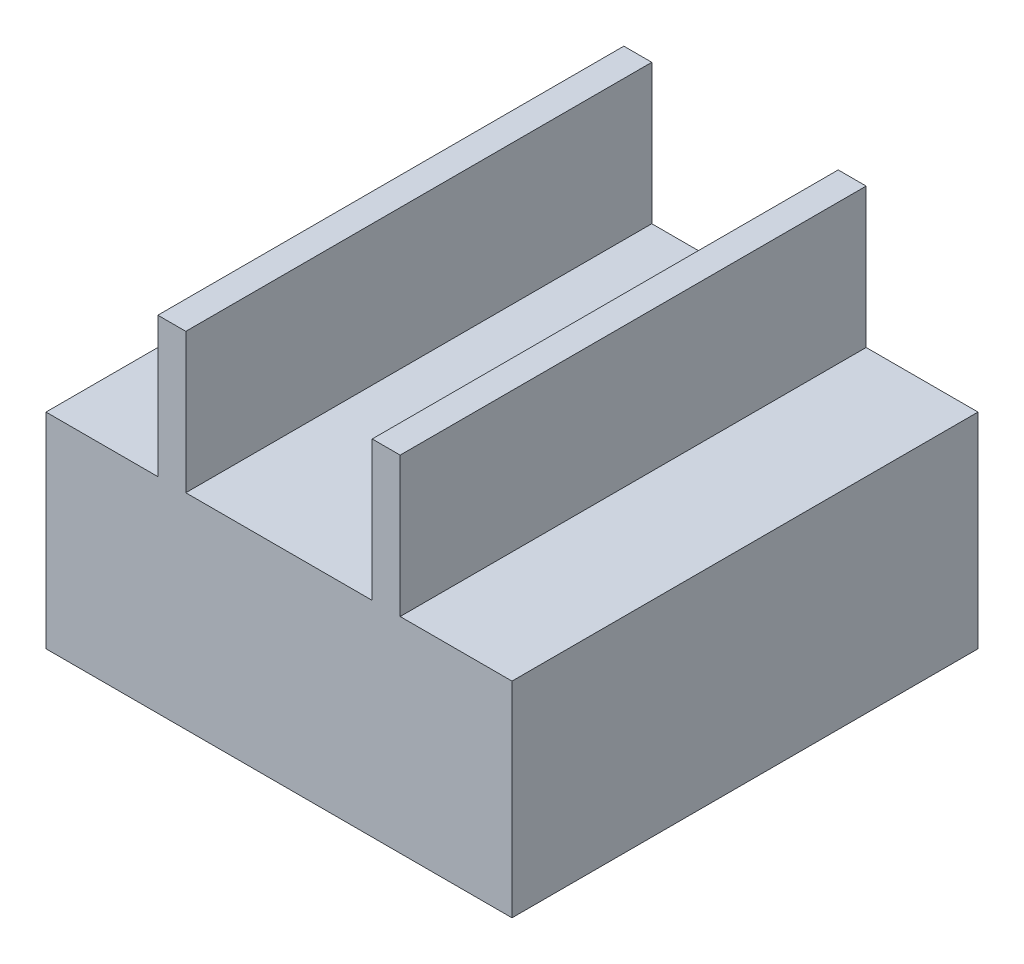
ISO-10303-21;
HEADER;
FILE_DESCRIPTION(('STEP AP214'),'2;1');
FILE_NAME('part.step','',(''),(''),'','','');
FILE_SCHEMA(('AUTOMOTIVE_DESIGN { 1 0 10303 214 1 1 1 1 }'));
ENDSEC;
DATA;
#1=APPLICATION_CONTEXT('core data for automotive mechanical design processes');
#2=APPLICATION_PROTOCOL_DEFINITION('international standard','automotive_design',2000,#1);
#3=PRODUCT_CONTEXT('',#1,'mechanical');
#4=PRODUCT('Part','Part','',(#3));
#5=PRODUCT_RELATED_PRODUCT_CATEGORY('part','',(#4));
#6=PRODUCT_DEFINITION_FORMATION('','',#4);
#7=PRODUCT_DEFINITION_CONTEXT('part definition',#1,'design');
#8=PRODUCT_DEFINITION('design','',#6,#7);
#9=PRODUCT_DEFINITION_SHAPE('','',#8);
#10=(LENGTH_UNIT() NAMED_UNIT(*) SI_UNIT(.MILLI.,.METRE.));
#11=(NAMED_UNIT(*) PLANE_ANGLE_UNIT() SI_UNIT($,.RADIAN.));
#12=(NAMED_UNIT(*) SI_UNIT($,.STERADIAN.) SOLID_ANGLE_UNIT());
#13=UNCERTAINTY_MEASURE_WITH_UNIT(LENGTH_MEASURE(1.E-05),#10,'distance_accuracy_value','');
#14=(GEOMETRIC_REPRESENTATION_CONTEXT(3) GLOBAL_UNCERTAINTY_ASSIGNED_CONTEXT((#13)) GLOBAL_UNIT_ASSIGNED_CONTEXT((#10,
#11,#12)) REPRESENTATION_CONTEXT('',''));
#15=CARTESIAN_POINT('',(0.,0.,0.));
#16=DIRECTION('',(0.,0.,1.));
#17=DIRECTION('',(1.,0.,0.));
#18=AXIS2_PLACEMENT_3D('',#15,#16,#17);
#19=CARTESIAN_POINT('',(-25.,2.,-25.));
#20=DIRECTION('',(1.,0.,0.));
#21=DIRECTION('',(0.,0.,-1.));
#22=AXIS2_PLACEMENT_3D('',#19,#20,#21);
#23=PLANE('',#22);
#24=DIRECTION('',(0.,-1.,0.));
#25=VECTOR('',#24,1.);
#26=CARTESIAN_POINT('',(-25.,2.,-25.));
#27=LINE('',#26,#25);
#28=CARTESIAN_POINT('',(-25.,2.,-25.));
#29=VERTEX_POINT('',#28);
#30=CARTESIAN_POINT('',(-25.,-20.,-25.));
#31=VERTEX_POINT('',#30);
#32=EDGE_CURVE('E280',#29,#31,#27,.T.);
#33=ORIENTED_EDGE('',*,*,#32,.T.);
#34=DIRECTION('',(0.,0.,-1.));
#35=VECTOR('',#34,1.);
#36=CARTESIAN_POINT('',(-25.,-20.,0.));
#37=LINE('',#36,#35);
#38=CARTESIAN_POINT('',(-25.,-20.,25.));
#39=VERTEX_POINT('',#38);
#40=EDGE_CURVE('E208',#39,#31,#37,.T.);
#41=ORIENTED_EDGE('',*,*,#40,.F.);
#42=DIRECTION('',(0.,-1.,0.));
#43=VECTOR('',#42,1.);
#44=CARTESIAN_POINT('',(-25.,2.,25.));
#45=LINE('',#44,#43);
#46=CARTESIAN_POINT('',(-25.,2.,25.));
#47=VERTEX_POINT('',#46);
#48=EDGE_CURVE('E287',#47,#39,#45,.T.);
#49=ORIENTED_EDGE('',*,*,#48,.F.);
#50=DIRECTION('',(0.,0.,1.));
#51=VECTOR('',#50,1.);
#52=CARTESIAN_POINT('',(-25.,2.,-25.));
#53=LINE('',#52,#51);
#54=EDGE_CURVE('E268',#29,#47,#53,.T.);
#55=ORIENTED_EDGE('',*,*,#54,.F.);
#56=EDGE_LOOP('',(#33,#41,#49,#55));
#57=FACE_BOUND('',#56,.T.);
#58=ADVANCED_FACE('F48',(#57),#23,.F.);
#59=CARTESIAN_POINT('',(0.,2.,0.));
#60=DIRECTION('',(0.,-1.,0.));
#61=DIRECTION('',(0.,0.,-1.));
#62=AXIS2_PLACEMENT_3D('',#59,#60,#61);
#63=PLANE('',#62);
#64=DIRECTION('',(0.,0.,1.));
#65=VECTOR('',#64,1.);
#66=CARTESIAN_POINT('',(10.,2.,0.));
#67=LINE('',#66,#65);
#68=CARTESIAN_POINT('',(10.,2.,-25.));
#69=VERTEX_POINT('',#68);
#70=CARTESIAN_POINT('',(10.,2.,25.));
#71=VERTEX_POINT('',#70);
#72=EDGE_CURVE('E219',#69,#71,#67,.T.);
#73=ORIENTED_EDGE('',*,*,#72,.F.);
#74=DIRECTION('',(-1.,0.,0.));
#75=VECTOR('',#74,1.);
#76=CARTESIAN_POINT('',(25.,2.,-25.));
#77=LINE('',#76,#75);
#78=CARTESIAN_POINT('',(-10.,2.,-25.));
#79=VERTEX_POINT('',#78);
#80=EDGE_CURVE('E281',#69,#79,#77,.T.);
#81=ORIENTED_EDGE('',*,*,#80,.T.);
#82=DIRECTION('',(0.,0.,1.));
#83=VECTOR('',#82,1.);
#84=CARTESIAN_POINT('',(-10.,2.,0.));
#85=LINE('',#84,#83);
#86=CARTESIAN_POINT('',(-10.,2.,25.));
#87=VERTEX_POINT('',#86);
#88=EDGE_CURVE('E246',#79,#87,#85,.T.);
#89=ORIENTED_EDGE('',*,*,#88,.T.);
#90=DIRECTION('',(1.,0.,0.));
#91=VECTOR('',#90,1.);
#92=CARTESIAN_POINT('',(25.,2.,25.));
#93=LINE('',#92,#91);
#94=EDGE_CURVE('E275',#87,#71,#93,.T.);
#95=ORIENTED_EDGE('',*,*,#94,.T.);
#96=EDGE_LOOP('',(#73,#81,#89,#95));
#97=FACE_BOUND('',#96,.T.);
#98=ADVANCED_FACE('F338',(#97),#63,.F.);
#99=DIRECTION('',(0.,0.,1.));
#100=VECTOR('',#99,1.);
#101=CARTESIAN_POINT('',(-13.,2.,0.));
#102=LINE('',#101,#100);
#103=CARTESIAN_POINT('',(-13.,2.,-25.));
#104=VERTEX_POINT('',#103);
#105=CARTESIAN_POINT('',(-13.,2.,25.));
#106=VERTEX_POINT('',#105);
#107=EDGE_CURVE('E241',#104,#106,#102,.T.);
#108=ORIENTED_EDGE('',*,*,#107,.F.);
#109=EDGE_CURVE('E277',#104,#29,#77,.T.);
#110=ORIENTED_EDGE('',*,*,#109,.T.);
#111=ORIENTED_EDGE('',*,*,#54,.T.);
#112=EDGE_CURVE('E272',#47,#106,#93,.T.);
#113=ORIENTED_EDGE('',*,*,#112,.T.);
#114=EDGE_LOOP('',(#108,#110,#111,#113));
#115=FACE_BOUND('',#114,.T.);
#116=ADVANCED_FACE('F344',(#115),#63,.F.);
#117=CARTESIAN_POINT('',(25.,2.,25.));
#118=DIRECTION('',(0.,0.,-1.));
#119=DIRECTION('',(-1.,0.,0.));
#120=AXIS2_PLACEMENT_3D('',#117,#118,#119);
#121=PLANE('',#120);
#122=DIRECTION('',(0.,-1.,0.));
#123=VECTOR('',#122,1.);
#124=CARTESIAN_POINT('',(10.,17.,25.));
#125=LINE('',#124,#123);
#126=CARTESIAN_POINT('',(10.,17.,25.));
#127=VERTEX_POINT('',#126);
#128=EDGE_CURVE('E232',#127,#71,#125,.T.);
#129=ORIENTED_EDGE('',*,*,#128,.T.);
#130=ORIENTED_EDGE('',*,*,#94,.F.);
#131=DIRECTION('',(0.,-1.,0.));
#132=VECTOR('',#131,1.);
#133=CARTESIAN_POINT('',(-10.,17.,25.));
#134=LINE('',#133,#132);
#135=CARTESIAN_POINT('',(-10.,17.,25.));
#136=VERTEX_POINT('',#135);
#137=EDGE_CURVE('E259',#136,#87,#134,.T.);
#138=ORIENTED_EDGE('',*,*,#137,.F.);
#139=DIRECTION('',(1.,0.,0.));
#140=VECTOR('',#139,1.);
#141=CARTESIAN_POINT('',(0.,17.,25.));
#142=LINE('',#141,#140);
#143=CARTESIAN_POINT('',(-13.,17.,25.));
#144=VERTEX_POINT('',#143);
#145=EDGE_CURVE('E248',#144,#136,#142,.T.);
#146=ORIENTED_EDGE('',*,*,#145,.F.);
#147=DIRECTION('',(0.,-1.,0.));
#148=VECTOR('',#147,1.);
#149=CARTESIAN_POINT('',(-13.,17.,25.));
#150=LINE('',#149,#148);
#151=EDGE_CURVE('E262',#144,#106,#150,.T.);
#152=ORIENTED_EDGE('',*,*,#151,.T.);
#153=ORIENTED_EDGE('',*,*,#112,.F.);
#154=ORIENTED_EDGE('',*,*,#48,.T.);
#155=DIRECTION('',(-1.,0.,0.));
#156=VECTOR('',#155,1.);
#157=CARTESIAN_POINT('',(-25.,-20.,25.));
#158=LINE('',#157,#156);
#159=CARTESIAN_POINT('',(25.,-20.,25.));
#160=VERTEX_POINT('',#159);
#161=EDGE_CURVE('E211',#160,#39,#158,.T.);
#162=ORIENTED_EDGE('',*,*,#161,.F.);
#163=DIRECTION('',(0.,-1.,0.));
#164=VECTOR('',#163,1.);
#165=CARTESIAN_POINT('',(25.,2.,25.));
#166=LINE('',#165,#164);
#167=CARTESIAN_POINT('',(25.,2.,25.));
#168=VERTEX_POINT('',#167);
#169=EDGE_CURVE('E285',#168,#160,#166,.T.);
#170=ORIENTED_EDGE('',*,*,#169,.F.);
#171=CARTESIAN_POINT('',(13.,2.,25.));
#172=VERTEX_POINT('',#171);
#173=EDGE_CURVE('E271',#172,#168,#93,.T.);
#174=ORIENTED_EDGE('',*,*,#173,.F.);
#175=DIRECTION('',(0.,-1.,0.));
#176=VECTOR('',#175,1.);
#177=CARTESIAN_POINT('',(13.,17.,25.));
#178=LINE('',#177,#176);
#179=CARTESIAN_POINT('',(13.,17.,25.));
#180=VERTEX_POINT('',#179);
#181=EDGE_CURVE('E225',#180,#172,#178,.T.);
#182=ORIENTED_EDGE('',*,*,#181,.F.);
#183=DIRECTION('',(1.,0.,0.));
#184=VECTOR('',#183,1.);
#185=CARTESIAN_POINT('',(0.,17.,25.));
#186=LINE('',#185,#184);
#187=EDGE_CURVE('E223',#127,#180,#186,.T.);
#188=ORIENTED_EDGE('',*,*,#187,.F.);
#189=EDGE_LOOP('',(#129,#130,#138,#146,#152,#153,#154,#162,#170,#174,#182,#188));
#190=FACE_BOUND('',#189,.T.);
#191=ADVANCED_FACE('F350',(#190),#121,.F.);
#192=CARTESIAN_POINT('',(25.,2.,-25.));
#193=DIRECTION('',(-1.,0.,0.));
#194=DIRECTION('',(0.,0.,1.));
#195=AXIS2_PLACEMENT_3D('',#192,#193,#194);
#196=PLANE('',#195);
#197=ORIENTED_EDGE('',*,*,#169,.T.);
#198=DIRECTION('',(0.,0.,1.));
#199=VECTOR('',#198,1.);
#200=CARTESIAN_POINT('',(25.,-20.,0.));
#201=LINE('',#200,#199);
#202=CARTESIAN_POINT('',(25.,-20.,-25.));
#203=VERTEX_POINT('',#202);
#204=EDGE_CURVE('E202',#203,#160,#201,.T.);
#205=ORIENTED_EDGE('',*,*,#204,.F.);
#206=DIRECTION('',(0.,-1.,0.));
#207=VECTOR('',#206,1.);
#208=CARTESIAN_POINT('',(25.,2.,-25.));
#209=LINE('',#208,#207);
#210=CARTESIAN_POINT('',(25.,2.,-25.));
#211=VERTEX_POINT('',#210);
#212=EDGE_CURVE('E283',#211,#203,#209,.T.);
#213=ORIENTED_EDGE('',*,*,#212,.F.);
#214=DIRECTION('',(0.,0.,-1.));
#215=VECTOR('',#214,1.);
#216=CARTESIAN_POINT('',(25.,2.,-25.));
#217=LINE('',#216,#215);
#218=EDGE_CURVE('E274',#168,#211,#217,.T.);
#219=ORIENTED_EDGE('',*,*,#218,.F.);
#220=EDGE_LOOP('',(#197,#205,#213,#219));
#221=FACE_BOUND('',#220,.T.);
#222=ADVANCED_FACE('F411',(#221),#196,.F.);
#223=CARTESIAN_POINT('',(25.,2.,-25.));
#224=DIRECTION('',(0.,0.,1.));
#225=DIRECTION('',(1.,0.,0.));
#226=AXIS2_PLACEMENT_3D('',#223,#224,#225);
#227=PLANE('',#226);
#228=DIRECTION('',(0.,-1.,0.));
#229=VECTOR('',#228,1.);
#230=CARTESIAN_POINT('',(-10.,17.,-25.));
#231=LINE('',#230,#229);
#232=CARTESIAN_POINT('',(-10.,17.,-25.));
#233=VERTEX_POINT('',#232);
#234=EDGE_CURVE('E253',#233,#79,#231,.T.);
#235=ORIENTED_EDGE('',*,*,#234,.T.);
#236=ORIENTED_EDGE('',*,*,#80,.F.);
#237=DIRECTION('',(0.,-1.,0.));
#238=VECTOR('',#237,1.);
#239=CARTESIAN_POINT('',(10.,17.,-25.));
#240=LINE('',#239,#238);
#241=CARTESIAN_POINT('',(10.,17.,-25.));
#242=VERTEX_POINT('',#241);
#243=EDGE_CURVE('E235',#242,#69,#240,.T.);
#244=ORIENTED_EDGE('',*,*,#243,.F.);
#245=DIRECTION('',(-1.,0.,0.));
#246=VECTOR('',#245,1.);
#247=CARTESIAN_POINT('',(0.,17.,-25.));
#248=LINE('',#247,#246);
#249=CARTESIAN_POINT('',(13.,17.,-25.));
#250=VERTEX_POINT('',#249);
#251=EDGE_CURVE('E218',#250,#242,#248,.T.);
#252=ORIENTED_EDGE('',*,*,#251,.F.);
#253=DIRECTION('',(0.,-1.,0.));
#254=VECTOR('',#253,1.);
#255=CARTESIAN_POINT('',(13.,17.,-25.));
#256=LINE('',#255,#254);
#257=CARTESIAN_POINT('',(13.,2.,-25.));
#258=VERTEX_POINT('',#257);
#259=EDGE_CURVE('E238',#250,#258,#256,.T.);
#260=ORIENTED_EDGE('',*,*,#259,.T.);
#261=EDGE_CURVE('E278',#211,#258,#77,.T.);
#262=ORIENTED_EDGE('',*,*,#261,.F.);
#263=ORIENTED_EDGE('',*,*,#212,.T.);
#264=DIRECTION('',(1.,0.,0.));
#265=VECTOR('',#264,1.);
#266=CARTESIAN_POINT('',(-25.,-20.,-25.));
#267=LINE('',#266,#265);
#268=EDGE_CURVE('E289',#31,#203,#267,.T.);
#269=ORIENTED_EDGE('',*,*,#268,.F.);
#270=ORIENTED_EDGE('',*,*,#32,.F.);
#271=ORIENTED_EDGE('',*,*,#109,.F.);
#272=DIRECTION('',(0.,-1.,0.));
#273=VECTOR('',#272,1.);
#274=CARTESIAN_POINT('',(-13.,17.,-25.));
#275=LINE('',#274,#273);
#276=CARTESIAN_POINT('',(-13.,17.,-25.));
#277=VERTEX_POINT('',#276);
#278=EDGE_CURVE('E265',#277,#104,#275,.T.);
#279=ORIENTED_EDGE('',*,*,#278,.F.);
#280=DIRECTION('',(-1.,0.,0.));
#281=VECTOR('',#280,1.);
#282=CARTESIAN_POINT('',(0.,17.,-25.));
#283=LINE('',#282,#281);
#284=EDGE_CURVE('E242',#233,#277,#283,.T.);
#285=ORIENTED_EDGE('',*,*,#284,.F.);
#286=EDGE_LOOP('',(#235,#236,#244,#252,#260,#262,#263,#269,#270,#271,#279,#285));
#287=FACE_BOUND('',#286,.T.);
#288=ADVANCED_FACE('F408',(#287),#227,.F.);
#289=ORIENTED_EDGE('',*,*,#261,.T.);
#290=DIRECTION('',(0.,0.,1.));
#291=VECTOR('',#290,1.);
#292=CARTESIAN_POINT('',(13.,2.,0.));
#293=LINE('',#292,#291);
#294=EDGE_CURVE('E214',#258,#172,#293,.T.);
#295=ORIENTED_EDGE('',*,*,#294,.T.);
#296=ORIENTED_EDGE('',*,*,#173,.T.);
#297=ORIENTED_EDGE('',*,*,#218,.T.);
#298=EDGE_LOOP('',(#289,#295,#296,#297));
#299=FACE_BOUND('',#298,.T.);
#300=ADVANCED_FACE('F347',(#299),#63,.F.);
#301=CARTESIAN_POINT('',(-13.,17.,0.));
#302=DIRECTION('',(1.,0.,0.));
#303=DIRECTION('',(0.,0.,-1.));
#304=AXIS2_PLACEMENT_3D('',#301,#302,#303);
#305=PLANE('',#304);
#306=ORIENTED_EDGE('',*,*,#107,.T.);
#307=ORIENTED_EDGE('',*,*,#151,.F.);
#308=DIRECTION('',(0.,0.,1.));
#309=VECTOR('',#308,1.);
#310=CARTESIAN_POINT('',(-13.,17.,0.));
#311=LINE('',#310,#309);
#312=EDGE_CURVE('E245',#277,#144,#311,.T.);
#313=ORIENTED_EDGE('',*,*,#312,.F.);
#314=ORIENTED_EDGE('',*,*,#278,.T.);
#315=EDGE_LOOP('',(#306,#307,#313,#314));
#316=FACE_BOUND('',#315,.T.);
#317=ADVANCED_FACE('F402',(#316),#305,.F.);
#318=CARTESIAN_POINT('',(-10.,17.,0.));
#319=DIRECTION('',(1.,0.,0.));
#320=DIRECTION('',(0.,0.,-1.));
#321=AXIS2_PLACEMENT_3D('',#318,#319,#320);
#322=PLANE('',#321);
#323=ORIENTED_EDGE('',*,*,#88,.F.);
#324=ORIENTED_EDGE('',*,*,#234,.F.);
#325=DIRECTION('',(0.,0.,1.));
#326=VECTOR('',#325,1.);
#327=CARTESIAN_POINT('',(-10.,17.,0.));
#328=LINE('',#327,#326);
#329=EDGE_CURVE('E250',#233,#136,#328,.T.);
#330=ORIENTED_EDGE('',*,*,#329,.T.);
#331=ORIENTED_EDGE('',*,*,#137,.T.);
#332=EDGE_LOOP('',(#323,#324,#330,#331));
#333=FACE_BOUND('',#332,.T.);
#334=ADVANCED_FACE('F398',(#333),#322,.T.);
#335=CARTESIAN_POINT('',(0.,17.,0.));
#336=DIRECTION('',(0.,1.,0.));
#337=DIRECTION('',(0.,0.,1.));
#338=AXIS2_PLACEMENT_3D('',#335,#336,#337);
#339=PLANE('',#338);
#340=ORIENTED_EDGE('',*,*,#284,.T.);
#341=ORIENTED_EDGE('',*,*,#312,.T.);
#342=ORIENTED_EDGE('',*,*,#145,.T.);
#343=ORIENTED_EDGE('',*,*,#329,.F.);
#344=EDGE_LOOP('',(#340,#341,#342,#343));
#345=FACE_BOUND('',#344,.T.);
#346=ADVANCED_FACE('F394',(#345),#339,.T.);
#347=CARTESIAN_POINT('',(13.,17.,0.));
#348=DIRECTION('',(1.,0.,0.));
#349=DIRECTION('',(0.,0.,-1.));
#350=AXIS2_PLACEMENT_3D('',#347,#348,#349);
#351=PLANE('',#350);
#352=ORIENTED_EDGE('',*,*,#294,.F.);
#353=ORIENTED_EDGE('',*,*,#259,.F.);
#354=DIRECTION('',(0.,0.,1.));
#355=VECTOR('',#354,1.);
#356=CARTESIAN_POINT('',(13.,17.,0.));
#357=LINE('',#356,#355);
#358=EDGE_CURVE('E215',#250,#180,#357,.T.);
#359=ORIENTED_EDGE('',*,*,#358,.T.);
#360=ORIENTED_EDGE('',*,*,#181,.T.);
#361=EDGE_LOOP('',(#352,#353,#359,#360));
#362=FACE_BOUND('',#361,.T.);
#363=ADVANCED_FACE('F390',(#362),#351,.T.);
#364=CARTESIAN_POINT('',(10.,17.,0.));
#365=DIRECTION('',(1.,0.,0.));
#366=DIRECTION('',(0.,0.,-1.));
#367=AXIS2_PLACEMENT_3D('',#364,#365,#366);
#368=PLANE('',#367);
#369=ORIENTED_EDGE('',*,*,#72,.T.);
#370=ORIENTED_EDGE('',*,*,#128,.F.);
#371=DIRECTION('',(0.,0.,1.));
#372=VECTOR('',#371,1.);
#373=CARTESIAN_POINT('',(10.,17.,0.));
#374=LINE('',#373,#372);
#375=EDGE_CURVE('E221',#242,#127,#374,.T.);
#376=ORIENTED_EDGE('',*,*,#375,.F.);
#377=ORIENTED_EDGE('',*,*,#243,.T.);
#378=EDGE_LOOP('',(#369,#370,#376,#377));
#379=FACE_BOUND('',#378,.T.);
#380=ADVANCED_FACE('F386',(#379),#368,.F.);
#381=CARTESIAN_POINT('',(0.,17.,0.));
#382=DIRECTION('',(0.,1.,0.));
#383=DIRECTION('',(0.,0.,1.));
#384=AXIS2_PLACEMENT_3D('',#381,#382,#383);
#385=PLANE('',#384);
#386=ORIENTED_EDGE('',*,*,#358,.F.);
#387=ORIENTED_EDGE('',*,*,#251,.T.);
#388=ORIENTED_EDGE('',*,*,#375,.T.);
#389=ORIENTED_EDGE('',*,*,#187,.T.);
#390=EDGE_LOOP('',(#386,#387,#388,#389));
#391=FACE_BOUND('',#390,.T.);
#392=ADVANCED_FACE('F382',(#391),#385,.T.);
#393=CARTESIAN_POINT('',(-25.,-20.,0.));
#394=DIRECTION('',(0.,-1.,0.));
#395=DIRECTION('',(0.,0.,-1.));
#396=AXIS2_PLACEMENT_3D('',#393,#394,#395);
#397=PLANE('',#396);
#398=DIRECTION('',(1.,0.,0.));
#399=VECTOR('',#398,1.);
#400=CARTESIAN_POINT('',(22.,-20.,24.));
#401=LINE('',#400,#399);
#402=CARTESIAN_POINT('',(-24.,-20.,24.));
#403=VERTEX_POINT('',#402);
#404=CARTESIAN_POINT('',(24.,-20.,24.));
#405=VERTEX_POINT('',#404);
#406=EDGE_CURVE('E297',#403,#405,#401,.T.);
#407=ORIENTED_EDGE('',*,*,#406,.T.);
#408=DIRECTION('',(0.,0.,-1.));
#409=VECTOR('',#408,1.);
#410=CARTESIAN_POINT('',(24.,-20.,-22.));
#411=LINE('',#410,#409);
#412=CARTESIAN_POINT('',(24.,-20.,-24.));
#413=VERTEX_POINT('',#412);
#414=EDGE_CURVE('E301',#405,#413,#411,.T.);
#415=ORIENTED_EDGE('',*,*,#414,.T.);
#416=DIRECTION('',(-1.,0.,0.));
#417=VECTOR('',#416,1.);
#418=CARTESIAN_POINT('',(-22.,-20.,-24.));
#419=LINE('',#418,#417);
#420=CARTESIAN_POINT('',(-24.,-20.,-24.));
#421=VERTEX_POINT('',#420);
#422=EDGE_CURVE('E299',#413,#421,#419,.T.);
#423=ORIENTED_EDGE('',*,*,#422,.T.);
#424=DIRECTION('',(0.,0.,1.));
#425=VECTOR('',#424,1.);
#426=CARTESIAN_POINT('',(-24.,-20.,22.));
#427=LINE('',#426,#425);
#428=EDGE_CURVE('E295',#421,#403,#427,.T.);
#429=ORIENTED_EDGE('',*,*,#428,.T.);
#430=EDGE_LOOP('',(#407,#415,#423,#429));
#431=FACE_BOUND('',#430,.T.);
#432=ORIENTED_EDGE('',*,*,#161,.T.);
#433=ORIENTED_EDGE('',*,*,#40,.T.);
#434=ORIENTED_EDGE('',*,*,#268,.T.);
#435=ORIENTED_EDGE('',*,*,#204,.T.);
#436=EDGE_LOOP('',(#432,#433,#434,#435));
#437=FACE_BOUND('',#436,.T.);
#438=ADVANCED_FACE('F334',(#431,#437),#397,.T.);
#439=CARTESIAN_POINT('',(-22.,-2.00000000000001,-22.));
#440=DIRECTION('',(-1.,0.,0.));
#441=DIRECTION('',(0.,0.,1.));
#442=AXIS2_PLACEMENT_3D('',#439,#440,#441);
#443=PLANE('',#442);
#444=DIRECTION('',(0.,-1.,0.));
#445=VECTOR('',#444,1.);
#446=CARTESIAN_POINT('',(-22.,-2.00000000000001,22.));
#447=LINE('',#446,#445);
#448=CARTESIAN_POINT('',(-22.,-2.00000000000001,22.));
#449=VERTEX_POINT('',#448);
#450=CARTESIAN_POINT('',(-22.,-18.,22.));
#451=VERTEX_POINT('',#450);
#452=EDGE_CURVE('E200',#449,#451,#447,.T.);
#453=ORIENTED_EDGE('',*,*,#452,.T.);
#454=DIRECTION('',(0.,0.,-1.));
#455=VECTOR('',#454,1.);
#456=CARTESIAN_POINT('',(-22.,-18.,-22.));
#457=LINE('',#456,#455);
#458=CARTESIAN_POINT('',(-22.,-18.,-22.));
#459=VERTEX_POINT('',#458);
#460=EDGE_CURVE('E11',#451,#459,#457,.T.);
#461=ORIENTED_EDGE('',*,*,#460,.T.);
#462=DIRECTION('',(0.,-1.,0.));
#463=VECTOR('',#462,1.);
#464=CARTESIAN_POINT('',(-22.,-2.00000000000001,-22.));
#465=LINE('',#464,#463);
#466=CARTESIAN_POINT('',(-22.,-2.00000000000001,-22.));
#467=VERTEX_POINT('',#466);
#468=EDGE_CURVE('E172',#467,#459,#465,.T.);
#469=ORIENTED_EDGE('',*,*,#468,.F.);
#470=DIRECTION('',(0.,0.,-1.));
#471=VECTOR('',#470,1.);
#472=CARTESIAN_POINT('',(-22.,-2.00000000000001,-22.));
#473=LINE('',#472,#471);
#474=EDGE_CURVE('E176',#449,#467,#473,.T.);
#475=ORIENTED_EDGE('',*,*,#474,.F.);
#476=EDGE_LOOP('',(#453,#461,#469,#475));
#477=FACE_BOUND('',#476,.T.);
#478=ADVANCED_FACE('F174',(#477),#443,.F.);
#479=CARTESIAN_POINT('',(22.,-2.00000000000001,22.));
#480=DIRECTION('',(0.,0.,1.));
#481=DIRECTION('',(1.,0.,0.));
#482=AXIS2_PLACEMENT_3D('',#479,#480,#481);
#483=PLANE('',#482);
#484=DIRECTION('',(0.,-1.,0.));
#485=VECTOR('',#484,1.);
#486=CARTESIAN_POINT('',(22.,-2.00000000000001,22.));
#487=LINE('',#486,#485);
#488=CARTESIAN_POINT('',(22.,-2.00000000000001,22.));
#489=VERTEX_POINT('',#488);
#490=CARTESIAN_POINT('',(22.,-18.,22.));
#491=VERTEX_POINT('',#490);
#492=EDGE_CURVE('E203',#489,#491,#487,.T.);
#493=ORIENTED_EDGE('',*,*,#492,.T.);
#494=DIRECTION('',(-1.,0.,0.));
#495=VECTOR('',#494,1.);
#496=CARTESIAN_POINT('',(-22.,-18.,22.));
#497=LINE('',#496,#495);
#498=EDGE_CURVE('E58',#491,#451,#497,.T.);
#499=ORIENTED_EDGE('',*,*,#498,.T.);
#500=ORIENTED_EDGE('',*,*,#452,.F.);
#501=DIRECTION('',(-1.,0.,0.));
#502=VECTOR('',#501,1.);
#503=CARTESIAN_POINT('',(22.,-2.00000000000001,22.));
#504=LINE('',#503,#502);
#505=EDGE_CURVE('E181',#489,#449,#504,.T.);
#506=ORIENTED_EDGE('',*,*,#505,.F.);
#507=EDGE_LOOP('',(#493,#499,#500,#506));
#508=FACE_BOUND('',#507,.T.);
#509=ADVANCED_FACE('F326',(#508),#483,.F.);
#510=CARTESIAN_POINT('',(22.,-2.00000000000001,-22.));
#511=DIRECTION('',(1.,0.,0.));
#512=DIRECTION('',(0.,0.,-1.));
#513=AXIS2_PLACEMENT_3D('',#510,#511,#512);
#514=PLANE('',#513);
#515=DIRECTION('',(0.,-1.,0.));
#516=VECTOR('',#515,1.);
#517=CARTESIAN_POINT('',(22.,-2.00000000000001,-22.));
#518=LINE('',#517,#516);
#519=CARTESIAN_POINT('',(22.,-2.00000000000001,-22.));
#520=VERTEX_POINT('',#519);
#521=CARTESIAN_POINT('',(22.,-18.,-22.));
#522=VERTEX_POINT('',#521);
#523=EDGE_CURVE('E180',#520,#522,#518,.T.);
#524=ORIENTED_EDGE('',*,*,#523,.T.);
#525=DIRECTION('',(0.,0.,1.));
#526=VECTOR('',#525,1.);
#527=CARTESIAN_POINT('',(22.,-18.,22.));
#528=LINE('',#527,#526);
#529=EDGE_CURVE('E292',#522,#491,#528,.T.);
#530=ORIENTED_EDGE('',*,*,#529,.T.);
#531=ORIENTED_EDGE('',*,*,#492,.F.);
#532=DIRECTION('',(0.,0.,1.));
#533=VECTOR('',#532,1.);
#534=CARTESIAN_POINT('',(22.,-2.00000000000001,-22.));
#535=LINE('',#534,#533);
#536=EDGE_CURVE('E190',#520,#489,#535,.T.);
#537=ORIENTED_EDGE('',*,*,#536,.F.);
#538=EDGE_LOOP('',(#524,#530,#531,#537));
#539=FACE_BOUND('',#538,.T.);
#540=ADVANCED_FACE('F325',(#539),#514,.F.);
#541=CARTESIAN_POINT('',(22.,-2.00000000000001,-22.));
#542=DIRECTION('',(0.,0.,-1.));
#543=DIRECTION('',(-1.,0.,0.));
#544=AXIS2_PLACEMENT_3D('',#541,#542,#543);
#545=PLANE('',#544);
#546=ORIENTED_EDGE('',*,*,#468,.T.);
#547=DIRECTION('',(1.,0.,0.));
#548=VECTOR('',#547,1.);
#549=CARTESIAN_POINT('',(22.,-18.,-22.));
#550=LINE('',#549,#548);
#551=EDGE_CURVE('E304',#459,#522,#550,.T.);
#552=ORIENTED_EDGE('',*,*,#551,.T.);
#553=ORIENTED_EDGE('',*,*,#523,.F.);
#554=DIRECTION('',(1.,0.,0.));
#555=VECTOR('',#554,1.);
#556=CARTESIAN_POINT('',(22.,-2.00000000000001,-22.));
#557=LINE('',#556,#555);
#558=EDGE_CURVE('E184',#467,#520,#557,.T.);
#559=ORIENTED_EDGE('',*,*,#558,.F.);
#560=EDGE_LOOP('',(#546,#552,#553,#559));
#561=FACE_BOUND('',#560,.T.);
#562=ADVANCED_FACE('F185',(#561),#545,.F.);
#563=CARTESIAN_POINT('',(0.,-2.00000000000001,0.));
#564=DIRECTION('',(0.,-1.,0.));
#565=DIRECTION('',(0.,0.,-1.));
#566=AXIS2_PLACEMENT_3D('',#563,#564,#565);
#567=PLANE('',#566);
#568=ORIENTED_EDGE('',*,*,#474,.T.);
#569=ORIENTED_EDGE('',*,*,#558,.T.);
#570=ORIENTED_EDGE('',*,*,#536,.T.);
#571=ORIENTED_EDGE('',*,*,#505,.T.);
#572=EDGE_LOOP('',(#568,#569,#570,#571));
#573=FACE_BOUND('',#572,.T.);
#574=ADVANCED_FACE('F192',(#573),#567,.T.);
#575=CARTESIAN_POINT('',(-22.,-18.,-22.));
#576=DIRECTION('',(0.707106781186546,-0.707106781186549,0.));
#577=DIRECTION('',(0.,0.,1.));
#578=AXIS2_PLACEMENT_3D('',#575,#576,#577);
#579=PLANE('',#578);
#580=DIRECTION('',(-0.577350269189627,-0.577350269189624,0.577350269189626));
#581=VECTOR('',#580,1.);
#582=CARTESIAN_POINT('',(-7.33333333333329,-3.33333333333335,7.33333333333329));
#583=LINE('',#582,#581);
#584=EDGE_CURVE('E196',#403,#451,#583,.F.);
#585=ORIENTED_EDGE('',*,*,#584,.F.);
#586=ORIENTED_EDGE('',*,*,#428,.F.);
#587=DIRECTION('',(0.577350269189627,0.577350269189624,0.577350269189626));
#588=VECTOR('',#587,1.);
#589=CARTESIAN_POINT('',(-7.33333333333329,-3.33333333333334,-7.3333333333333));
#590=LINE('',#589,#588);
#591=EDGE_CURVE('E53',#459,#421,#590,.F.);
#592=ORIENTED_EDGE('',*,*,#591,.F.);
#593=ORIENTED_EDGE('',*,*,#460,.F.);
#594=EDGE_LOOP('',(#585,#586,#592,#593));
#595=FACE_BOUND('',#594,.T.);
#596=ADVANCED_FACE('F51',(#595),#579,.T.);
#597=CARTESIAN_POINT('',(22.,-18.,-22.));
#598=DIRECTION('',(0.,-0.707106781186549,0.707106781186546));
#599=DIRECTION('',(-1.,0.,0.));
#600=AXIS2_PLACEMENT_3D('',#597,#598,#599);
#601=PLANE('',#600);
#602=ORIENTED_EDGE('',*,*,#591,.T.);
#603=ORIENTED_EDGE('',*,*,#422,.F.);
#604=DIRECTION('',(-0.577350269189627,0.577350269189625,0.577350269189626));
#605=VECTOR('',#604,1.);
#606=CARTESIAN_POINT('',(22.,-18.,-22.));
#607=LINE('',#606,#605);
#608=EDGE_CURVE('E309',#522,#413,#607,.F.);
#609=ORIENTED_EDGE('',*,*,#608,.F.);
#610=ORIENTED_EDGE('',*,*,#551,.F.);
#611=EDGE_LOOP('',(#602,#603,#609,#610));
#612=FACE_BOUND('',#611,.T.);
#613=ADVANCED_FACE('F322',(#612),#601,.T.);
#614=CARTESIAN_POINT('',(22.,-18.,22.));
#615=DIRECTION('',(0.,-0.707106781186549,-0.707106781186546));
#616=DIRECTION('',(1.,0.,0.));
#617=AXIS2_PLACEMENT_3D('',#614,#615,#616);
#618=PLANE('',#617);
#619=ORIENTED_EDGE('',*,*,#584,.T.);
#620=ORIENTED_EDGE('',*,*,#498,.F.);
#621=DIRECTION('',(0.577350269189627,-0.577350269189624,0.577350269189627));
#622=VECTOR('',#621,1.);
#623=CARTESIAN_POINT('',(7.33333333333329,-3.33333333333335,7.33333333333329));
#624=LINE('',#623,#622);
#625=EDGE_CURVE('E307',#405,#491,#624,.F.);
#626=ORIENTED_EDGE('',*,*,#625,.F.);
#627=ORIENTED_EDGE('',*,*,#406,.F.);
#628=EDGE_LOOP('',(#619,#620,#626,#627));
#629=FACE_BOUND('',#628,.T.);
#630=ADVANCED_FACE('F314',(#629),#618,.T.);
#631=CARTESIAN_POINT('',(22.,-18.,-22.));
#632=DIRECTION('',(-0.707106781186546,-0.707106781186549,0.));
#633=DIRECTION('',(0.,0.,-1.));
#634=AXIS2_PLACEMENT_3D('',#631,#632,#633);
#635=PLANE('',#634);
#636=ORIENTED_EDGE('',*,*,#608,.T.);
#637=ORIENTED_EDGE('',*,*,#414,.F.);
#638=ORIENTED_EDGE('',*,*,#625,.T.);
#639=ORIENTED_EDGE('',*,*,#529,.F.);
#640=EDGE_LOOP('',(#636,#637,#638,#639));
#641=FACE_BOUND('',#640,.T.);
#642=ADVANCED_FACE('F353',(#641),#635,.T.);
#643=CLOSED_SHELL('',(#58,#98,#116,#191,#222,#288,#300,#317,#334,#346,#363,#380,#392,#438,#478,
#509,#540,#562,#574,#596,#613,#630,#642));
#644=MANIFOLD_SOLID_BREP('B2',#643);
#645=ADVANCED_BREP_SHAPE_REPRESENTATION('',(#18,#644),#14);
#646=SHAPE_DEFINITION_REPRESENTATION(#9,#645);
ENDSEC;
END-ISO-10303-21;
